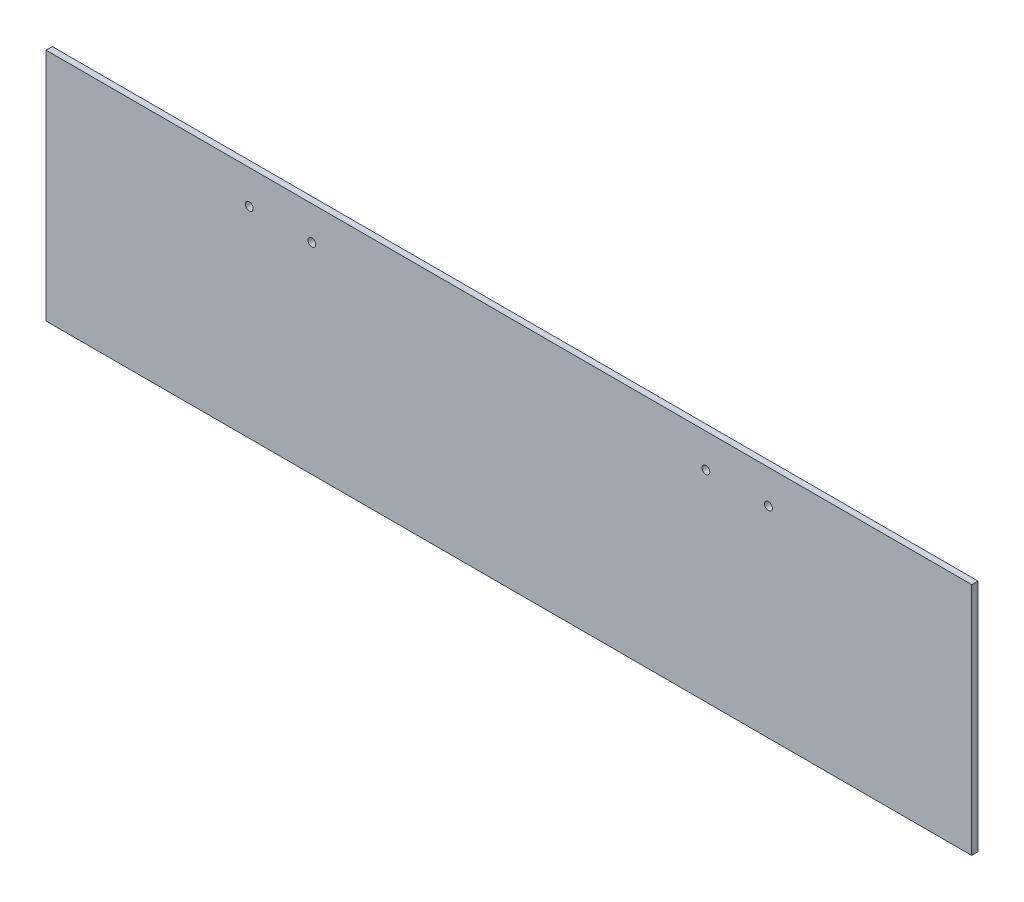
ISO-10303-21;
HEADER;
FILE_DESCRIPTION(('STEP AP214'),'2;1');
FILE_NAME('part.step','',(''),(''),'','','');
FILE_SCHEMA(('AUTOMOTIVE_DESIGN { 1 0 10303 214 1 1 1 1 }'));
ENDSEC;
DATA;
#1=APPLICATION_CONTEXT('core data for automotive mechanical design processes');
#2=APPLICATION_PROTOCOL_DEFINITION('international standard','automotive_design',2000,#1);
#3=PRODUCT_CONTEXT('',#1,'mechanical');
#4=PRODUCT('Part','Part','',(#3));
#5=PRODUCT_RELATED_PRODUCT_CATEGORY('part','',(#4));
#6=PRODUCT_DEFINITION_FORMATION('','',#4);
#7=PRODUCT_DEFINITION_CONTEXT('part definition',#1,'design');
#8=PRODUCT_DEFINITION('design','',#6,#7);
#9=PRODUCT_DEFINITION_SHAPE('','',#8);
#10=(LENGTH_UNIT() NAMED_UNIT(*) SI_UNIT(.MILLI.,.METRE.));
#11=(NAMED_UNIT(*) PLANE_ANGLE_UNIT() SI_UNIT($,.RADIAN.));
#12=(NAMED_UNIT(*) SI_UNIT($,.STERADIAN.) SOLID_ANGLE_UNIT());
#13=UNCERTAINTY_MEASURE_WITH_UNIT(LENGTH_MEASURE(1.E-05),#10,'distance_accuracy_value','');
#14=(GEOMETRIC_REPRESENTATION_CONTEXT(3) GLOBAL_UNCERTAINTY_ASSIGNED_CONTEXT((#13)) GLOBAL_UNIT_ASSIGNED_CONTEXT((#10,
#11,#12)) REPRESENTATION_CONTEXT('',''));
#15=CARTESIAN_POINT('',(0.,0.,0.));
#16=DIRECTION('',(0.,0.,1.));
#17=DIRECTION('',(1.,0.,0.));
#18=AXIS2_PLACEMENT_3D('',#15,#16,#17);
#19=CARTESIAN_POINT('',(-296.,150.,2.));
#20=DIRECTION('',(1.,0.,0.));
#21=DIRECTION('',(0.,0.,-1.));
#22=AXIS2_PLACEMENT_3D('',#19,#20,#21);
#23=PLANE('',#22);
#24=DIRECTION('',(0.,-1.,0.));
#25=VECTOR('',#24,1.);
#26=CARTESIAN_POINT('',(-296.,150.,-2.));
#27=LINE('',#26,#25);
#28=CARTESIAN_POINT('',(-296.,150.,-2.));
#29=VERTEX_POINT('',#28);
#30=CARTESIAN_POINT('',(-296.,0.,-2.));
#31=VERTEX_POINT('',#30);
#32=EDGE_CURVE('E105',#29,#31,#27,.T.);
#33=ORIENTED_EDGE('',*,*,#32,.T.);
#34=DIRECTION('',(0.,0.,-1.));
#35=VECTOR('',#34,1.);
#36=CARTESIAN_POINT('',(-296.,0.,2.));
#37=LINE('',#36,#35);
#38=CARTESIAN_POINT('',(-296.,0.,2.));
#39=VERTEX_POINT('',#38);
#40=EDGE_CURVE('E11',#39,#31,#37,.T.);
#41=ORIENTED_EDGE('',*,*,#40,.F.);
#42=DIRECTION('',(0.,-1.,0.));
#43=VECTOR('',#42,1.);
#44=CARTESIAN_POINT('',(-296.,150.,2.));
#45=LINE('',#44,#43);
#46=CARTESIAN_POINT('',(-296.,150.,2.));
#47=VERTEX_POINT('',#46);
#48=EDGE_CURVE('E89',#47,#39,#45,.T.);
#49=ORIENTED_EDGE('',*,*,#48,.F.);
#50=DIRECTION('',(0.,0.,-1.));
#51=VECTOR('',#50,1.);
#52=CARTESIAN_POINT('',(-296.,150.,2.));
#53=LINE('',#52,#51);
#54=EDGE_CURVE('E98',#47,#29,#53,.T.);
#55=ORIENTED_EDGE('',*,*,#54,.T.);
#56=EDGE_LOOP('',(#33,#41,#49,#55));
#57=FACE_BOUND('',#56,.T.);
#58=ADVANCED_FACE('F39',(#57),#23,.F.);
#59=CARTESIAN_POINT('',(296.,0.,2.));
#60=DIRECTION('',(0.,1.,0.));
#61=DIRECTION('',(-1.,0.,0.));
#62=AXIS2_PLACEMENT_3D('',#59,#60,#61);
#63=PLANE('',#62);
#64=DIRECTION('',(1.,0.,0.));
#65=VECTOR('',#64,1.);
#66=CARTESIAN_POINT('',(296.,0.,-2.));
#67=LINE('',#66,#65);
#68=CARTESIAN_POINT('',(296.,0.,-2.));
#69=VERTEX_POINT('',#68);
#70=EDGE_CURVE('E94',#31,#69,#67,.T.);
#71=ORIENTED_EDGE('',*,*,#70,.T.);
#72=DIRECTION('',(0.,0.,-1.));
#73=VECTOR('',#72,1.);
#74=CARTESIAN_POINT('',(296.,0.,2.));
#75=LINE('',#74,#73);
#76=CARTESIAN_POINT('',(296.,0.,2.));
#77=VERTEX_POINT('',#76);
#78=EDGE_CURVE('E50',#77,#69,#75,.T.);
#79=ORIENTED_EDGE('',*,*,#78,.F.);
#80=DIRECTION('',(1.,0.,0.));
#81=VECTOR('',#80,1.);
#82=CARTESIAN_POINT('',(296.,0.,2.));
#83=LINE('',#82,#81);
#84=EDGE_CURVE('E81',#39,#77,#83,.T.);
#85=ORIENTED_EDGE('',*,*,#84,.F.);
#86=ORIENTED_EDGE('',*,*,#40,.T.);
#87=EDGE_LOOP('',(#71,#79,#85,#86));
#88=FACE_BOUND('',#87,.T.);
#89=ADVANCED_FACE('F91',(#88),#63,.F.);
#90=CARTESIAN_POINT('',(296.,150.,2.));
#91=DIRECTION('',(-1.,0.,0.));
#92=DIRECTION('',(0.,-1.,0.));
#93=AXIS2_PLACEMENT_3D('',#90,#91,#92);
#94=PLANE('',#93);
#95=DIRECTION('',(0.,1.,0.));
#96=VECTOR('',#95,1.);
#97=CARTESIAN_POINT('',(296.,150.,-2.));
#98=LINE('',#97,#96);
#99=CARTESIAN_POINT('',(296.,150.,-2.));
#100=VERTEX_POINT('',#99);
#101=EDGE_CURVE('E75',#69,#100,#98,.T.);
#102=ORIENTED_EDGE('',*,*,#101,.T.);
#103=DIRECTION('',(0.,0.,-1.));
#104=VECTOR('',#103,1.);
#105=CARTESIAN_POINT('',(296.,150.,2.));
#106=LINE('',#105,#104);
#107=CARTESIAN_POINT('',(296.,150.,2.));
#108=VERTEX_POINT('',#107);
#109=EDGE_CURVE('E92',#108,#100,#106,.T.);
#110=ORIENTED_EDGE('',*,*,#109,.F.);
#111=DIRECTION('',(0.,1.,0.));
#112=VECTOR('',#111,1.);
#113=CARTESIAN_POINT('',(296.,150.,2.));
#114=LINE('',#113,#112);
#115=EDGE_CURVE('E86',#77,#108,#114,.T.);
#116=ORIENTED_EDGE('',*,*,#115,.F.);
#117=ORIENTED_EDGE('',*,*,#78,.T.);
#118=EDGE_LOOP('',(#102,#110,#116,#117));
#119=FACE_BOUND('',#118,.T.);
#120=ADVANCED_FACE('F96',(#119),#94,.F.);
#121=CARTESIAN_POINT('',(296.,150.,2.));
#122=DIRECTION('',(0.,-1.,0.));
#123=DIRECTION('',(1.,0.,0.));
#124=AXIS2_PLACEMENT_3D('',#121,#122,#123);
#125=PLANE('',#124);
#126=DIRECTION('',(-1.,0.,0.));
#127=VECTOR('',#126,1.);
#128=CARTESIAN_POINT('',(296.,150.,-2.));
#129=LINE('',#128,#127);
#130=EDGE_CURVE('E80',#100,#29,#129,.T.);
#131=ORIENTED_EDGE('',*,*,#130,.T.);
#132=ORIENTED_EDGE('',*,*,#54,.F.);
#133=DIRECTION('',(-1.,0.,0.));
#134=VECTOR('',#133,1.);
#135=CARTESIAN_POINT('',(296.,150.,2.));
#136=LINE('',#135,#134);
#137=EDGE_CURVE('E54',#108,#47,#136,.T.);
#138=ORIENTED_EDGE('',*,*,#137,.F.);
#139=ORIENTED_EDGE('',*,*,#109,.T.);
#140=EDGE_LOOP('',(#131,#132,#138,#139));
#141=FACE_BOUND('',#140,.T.);
#142=ADVANCED_FACE('F109',(#141),#125,.F.);
#143=CARTESIAN_POINT('',(0.,0.,2.));
#144=DIRECTION('',(0.,0.,-1.));
#145=DIRECTION('',(-1.,0.,0.));
#146=AXIS2_PLACEMENT_3D('',#143,#144,#145);
#147=PLANE('',#146);
#148=CARTESIAN_POINT('',(-166.,128.5,2.));
#149=DIRECTION('',(0.,0.,1.));
#150=DIRECTION('',(1.,0.,0.));
#151=AXIS2_PLACEMENT_3D('',#148,#149,#150);
#152=CIRCLE('',#151,2.5);
#153=CARTESIAN_POINT('',(-163.5,128.5,2.));
#154=VERTEX_POINT('',#153);
#155=EDGE_CURVE('E137',#154,#154,#152,.T.);
#156=ORIENTED_EDGE('',*,*,#155,.F.);
#157=EDGE_LOOP('',(#156));
#158=FACE_BOUND('',#157,.T.);
#159=CARTESIAN_POINT('',(-126.,128.5,2.));
#160=DIRECTION('',(0.,0.,1.));
#161=DIRECTION('',(1.,0.,0.));
#162=AXIS2_PLACEMENT_3D('',#159,#160,#161);
#163=CIRCLE('',#162,2.5);
#164=CARTESIAN_POINT('',(-123.5,128.5,2.));
#165=VERTEX_POINT('',#164);
#166=EDGE_CURVE('E128',#165,#165,#163,.T.);
#167=ORIENTED_EDGE('',*,*,#166,.F.);
#168=EDGE_LOOP('',(#167));
#169=FACE_BOUND('',#168,.T.);
#170=CARTESIAN_POINT('',(126.,128.5,2.));
#171=DIRECTION('',(0.,0.,1.));
#172=DIRECTION('',(1.,0.,0.));
#173=AXIS2_PLACEMENT_3D('',#170,#171,#172);
#174=CIRCLE('',#173,2.5);
#175=CARTESIAN_POINT('',(128.5,128.5,2.));
#176=VERTEX_POINT('',#175);
#177=EDGE_CURVE('E124',#176,#176,#174,.T.);
#178=ORIENTED_EDGE('',*,*,#177,.F.);
#179=EDGE_LOOP('',(#178));
#180=FACE_BOUND('',#179,.T.);
#181=CARTESIAN_POINT('',(166.,128.5,2.));
#182=DIRECTION('',(0.,0.,1.));
#183=DIRECTION('',(1.,0.,0.));
#184=AXIS2_PLACEMENT_3D('',#181,#182,#183);
#185=CIRCLE('',#184,2.5);
#186=CARTESIAN_POINT('',(168.5,128.5,2.));
#187=VERTEX_POINT('',#186);
#188=EDGE_CURVE('E120',#187,#187,#185,.T.);
#189=ORIENTED_EDGE('',*,*,#188,.F.);
#190=EDGE_LOOP('',(#189));
#191=FACE_BOUND('',#190,.T.);
#192=ORIENTED_EDGE('',*,*,#48,.T.);
#193=ORIENTED_EDGE('',*,*,#84,.T.);
#194=ORIENTED_EDGE('',*,*,#115,.T.);
#195=ORIENTED_EDGE('',*,*,#137,.T.);
#196=EDGE_LOOP('',(#192,#193,#194,#195));
#197=FACE_BOUND('',#196,.T.);
#198=ADVANCED_FACE('F88',(#158,#169,#180,#191,#197),#147,.F.);
#199=CARTESIAN_POINT('',(0.,0.,-2.));
#200=DIRECTION('',(0.,0.,-1.));
#201=DIRECTION('',(-1.,0.,0.));
#202=AXIS2_PLACEMENT_3D('',#199,#200,#201);
#203=PLANE('',#202);
#204=CARTESIAN_POINT('',(-166.,128.5,-2.));
#205=DIRECTION('',(0.,0.,1.));
#206=DIRECTION('',(1.,0.,0.));
#207=AXIS2_PLACEMENT_3D('',#204,#205,#206);
#208=CIRCLE('',#207,2.5);
#209=CARTESIAN_POINT('',(-163.5,128.5,-2.));
#210=VERTEX_POINT('',#209);
#211=EDGE_CURVE('E135',#210,#210,#208,.T.);
#212=ORIENTED_EDGE('',*,*,#211,.T.);
#213=EDGE_LOOP('',(#212));
#214=FACE_BOUND('',#213,.T.);
#215=CARTESIAN_POINT('',(-126.,128.5,-2.));
#216=DIRECTION('',(0.,0.,1.));
#217=DIRECTION('',(1.,0.,0.));
#218=AXIS2_PLACEMENT_3D('',#215,#216,#217);
#219=CIRCLE('',#218,2.5);
#220=CARTESIAN_POINT('',(-123.5,128.5,-2.));
#221=VERTEX_POINT('',#220);
#222=EDGE_CURVE('E130',#221,#221,#219,.T.);
#223=ORIENTED_EDGE('',*,*,#222,.T.);
#224=EDGE_LOOP('',(#223));
#225=FACE_BOUND('',#224,.T.);
#226=CARTESIAN_POINT('',(126.,128.5,-2.));
#227=DIRECTION('',(0.,0.,1.));
#228=DIRECTION('',(1.,0.,0.));
#229=AXIS2_PLACEMENT_3D('',#226,#227,#228);
#230=CIRCLE('',#229,2.5);
#231=CARTESIAN_POINT('',(128.5,128.5,-2.));
#232=VERTEX_POINT('',#231);
#233=EDGE_CURVE('E122',#232,#232,#230,.T.);
#234=ORIENTED_EDGE('',*,*,#233,.T.);
#235=EDGE_LOOP('',(#234));
#236=FACE_BOUND('',#235,.T.);
#237=CARTESIAN_POINT('',(166.,128.5,-2.));
#238=DIRECTION('',(0.,0.,1.));
#239=DIRECTION('',(1.,0.,0.));
#240=AXIS2_PLACEMENT_3D('',#237,#238,#239);
#241=CIRCLE('',#240,2.5);
#242=CARTESIAN_POINT('',(168.5,128.5,-2.));
#243=VERTEX_POINT('',#242);
#244=EDGE_CURVE('E104',#243,#243,#241,.T.);
#245=ORIENTED_EDGE('',*,*,#244,.T.);
#246=EDGE_LOOP('',(#245));
#247=FACE_BOUND('',#246,.T.);
#248=ORIENTED_EDGE('',*,*,#32,.F.);
#249=ORIENTED_EDGE('',*,*,#130,.F.);
#250=ORIENTED_EDGE('',*,*,#101,.F.);
#251=ORIENTED_EDGE('',*,*,#70,.F.);
#252=EDGE_LOOP('',(#248,#249,#250,#251));
#253=FACE_BOUND('',#252,.T.);
#254=ADVANCED_FACE('F114',(#214,#225,#236,#247,#253),#203,.T.);
#255=CARTESIAN_POINT('',(166.,128.5,2.));
#256=DIRECTION('',(0.,0.,1.));
#257=DIRECTION('',(1.,0.,0.));
#258=AXIS2_PLACEMENT_3D('',#255,#256,#257);
#259=CYLINDRICAL_SURFACE('',#258,2.5);
#260=ORIENTED_EDGE('',*,*,#244,.F.);
#261=EDGE_LOOP('',(#260));
#262=FACE_BOUND('',#261,.T.);
#263=ORIENTED_EDGE('',*,*,#188,.T.);
#264=EDGE_LOOP('',(#263));
#265=FACE_BOUND('',#264,.T.);
#266=ADVANCED_FACE('F151',(#262,#265),#259,.F.);
#267=CARTESIAN_POINT('',(126.,128.5,2.));
#268=DIRECTION('',(0.,0.,1.));
#269=DIRECTION('',(1.,0.,0.));
#270=AXIS2_PLACEMENT_3D('',#267,#268,#269);
#271=CYLINDRICAL_SURFACE('',#270,2.5);
#272=ORIENTED_EDGE('',*,*,#233,.F.);
#273=EDGE_LOOP('',(#272));
#274=FACE_BOUND('',#273,.T.);
#275=ORIENTED_EDGE('',*,*,#177,.T.);
#276=EDGE_LOOP('',(#275));
#277=FACE_BOUND('',#276,.T.);
#278=ADVANCED_FACE('F153',(#274,#277),#271,.F.);
#279=CARTESIAN_POINT('',(-126.,128.5,2.));
#280=DIRECTION('',(0.,0.,1.));
#281=DIRECTION('',(1.,0.,0.));
#282=AXIS2_PLACEMENT_3D('',#279,#280,#281);
#283=CYLINDRICAL_SURFACE('',#282,2.5);
#284=ORIENTED_EDGE('',*,*,#222,.F.);
#285=EDGE_LOOP('',(#284));
#286=FACE_BOUND('',#285,.T.);
#287=ORIENTED_EDGE('',*,*,#166,.T.);
#288=EDGE_LOOP('',(#287));
#289=FACE_BOUND('',#288,.T.);
#290=ADVANCED_FACE('F159',(#286,#289),#283,.F.);
#291=CARTESIAN_POINT('',(-166.,128.5,2.));
#292=DIRECTION('',(0.,0.,1.));
#293=DIRECTION('',(1.,0.,0.));
#294=AXIS2_PLACEMENT_3D('',#291,#292,#293);
#295=CYLINDRICAL_SURFACE('',#294,2.5);
#296=ORIENTED_EDGE('',*,*,#211,.F.);
#297=EDGE_LOOP('',(#296));
#298=FACE_BOUND('',#297,.T.);
#299=ORIENTED_EDGE('',*,*,#155,.T.);
#300=EDGE_LOOP('',(#299));
#301=FACE_BOUND('',#300,.T.);
#302=ADVANCED_FACE('F136',(#298,#301),#295,.F.);
#303=CLOSED_SHELL('',(#58,#89,#120,#142,#198,#254,#266,#278,#290,#302));
#304=MANIFOLD_SOLID_BREP('B2',#303);
#305=ADVANCED_BREP_SHAPE_REPRESENTATION('',(#18,#304),#14);
#306=SHAPE_DEFINITION_REPRESENTATION(#9,#305);
ENDSEC;
END-ISO-10303-21;
